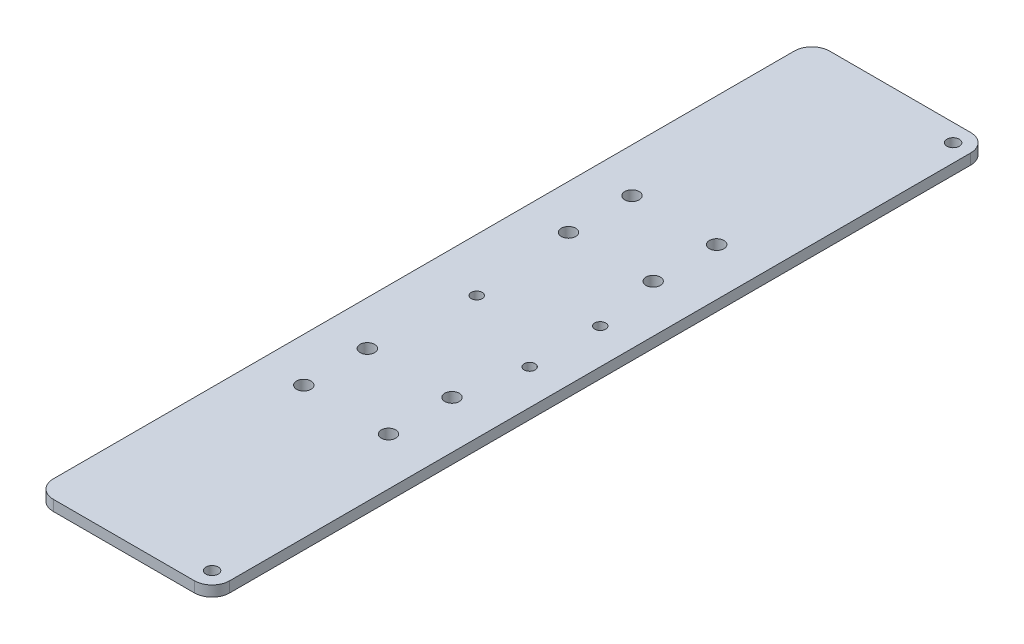
ISO-10303-21;
HEADER;
FILE_DESCRIPTION(('STEP AP214'),'2;1');
FILE_NAME('part.step','',(''),(''),'','','');
FILE_SCHEMA(('AUTOMOTIVE_DESIGN { 1 0 10303 214 1 1 1 1 }'));
ENDSEC;
DATA;
#1=APPLICATION_CONTEXT('core data for automotive mechanical design processes');
#2=APPLICATION_PROTOCOL_DEFINITION('international standard','automotive_design',2000,#1);
#3=PRODUCT_CONTEXT('',#1,'mechanical');
#4=PRODUCT('Part','Part','',(#3));
#5=PRODUCT_RELATED_PRODUCT_CATEGORY('part','',(#4));
#6=PRODUCT_DEFINITION_FORMATION('','',#4);
#7=PRODUCT_DEFINITION_CONTEXT('part definition',#1,'design');
#8=PRODUCT_DEFINITION('design','',#6,#7);
#9=PRODUCT_DEFINITION_SHAPE('','',#8);
#10=(LENGTH_UNIT() NAMED_UNIT(*) SI_UNIT(.MILLI.,.METRE.));
#11=(NAMED_UNIT(*) PLANE_ANGLE_UNIT() SI_UNIT($,.RADIAN.));
#12=(NAMED_UNIT(*) SI_UNIT($,.STERADIAN.) SOLID_ANGLE_UNIT());
#13=UNCERTAINTY_MEASURE_WITH_UNIT(LENGTH_MEASURE(1.E-05),#10,'distance_accuracy_value','');
#14=(GEOMETRIC_REPRESENTATION_CONTEXT(3) GLOBAL_UNCERTAINTY_ASSIGNED_CONTEXT((#13)) GLOBAL_UNIT_ASSIGNED_CONTEXT((#10,
#11,#12)) REPRESENTATION_CONTEXT('',''));
#15=CARTESIAN_POINT('',(0.,0.,0.));
#16=DIRECTION('',(0.,0.,1.));
#17=DIRECTION('',(1.,0.,0.));
#18=AXIS2_PLACEMENT_3D('',#15,#16,#17);
#19=CARTESIAN_POINT('',(-25.,3.,-110.));
#20=DIRECTION('',(1.,0.,0.));
#21=DIRECTION('',(0.,0.,-1.));
#22=AXIS2_PLACEMENT_3D('',#19,#20,#21);
#23=PLANE('',#22);
#24=DIRECTION('',(0.,0.,1.));
#25=VECTOR('',#24,1.);
#26=CARTESIAN_POINT('',(-25.,3.,-110.));
#27=LINE('',#26,#25);
#28=CARTESIAN_POINT('',(-25.,3.,-105.));
#29=VERTEX_POINT('',#28);
#30=CARTESIAN_POINT('',(-25.,3.,105.));
#31=VERTEX_POINT('',#30);
#32=EDGE_CURVE('E128',#29,#31,#27,.T.);
#33=ORIENTED_EDGE('',*,*,#32,.F.);
#34=DIRECTION('',(0.,-1.,0.));
#35=VECTOR('',#34,1.);
#36=CARTESIAN_POINT('',(-25.,3.,-105.));
#37=LINE('',#36,#35);
#38=CARTESIAN_POINT('',(-25.,0.,-105.));
#39=VERTEX_POINT('',#38);
#40=EDGE_CURVE('E154',#29,#39,#37,.T.);
#41=ORIENTED_EDGE('',*,*,#40,.T.);
#42=DIRECTION('',(0.,0.,1.));
#43=VECTOR('',#42,1.);
#44=CARTESIAN_POINT('',(-25.,0.,-110.));
#45=LINE('',#44,#43);
#46=CARTESIAN_POINT('',(-25.,0.,105.));
#47=VERTEX_POINT('',#46);
#48=EDGE_CURVE('E160',#39,#47,#45,.T.);
#49=ORIENTED_EDGE('',*,*,#48,.T.);
#50=DIRECTION('',(0.,-1.,0.));
#51=VECTOR('',#50,1.);
#52=CARTESIAN_POINT('',(-25.,3.,105.));
#53=LINE('',#52,#51);
#54=EDGE_CURVE('E152',#47,#31,#53,.F.);
#55=ORIENTED_EDGE('',*,*,#54,.T.);
#56=EDGE_LOOP('',(#33,#41,#49,#55));
#57=FACE_BOUND('',#56,.T.);
#58=ADVANCED_FACE('F36',(#57),#23,.F.);
#59=CARTESIAN_POINT('',(-25.,3.,110.));
#60=DIRECTION('',(0.,0.,-1.));
#61=DIRECTION('',(-1.,0.,0.));
#62=AXIS2_PLACEMENT_3D('',#59,#60,#61);
#63=PLANE('',#62);
#64=DIRECTION('',(1.,0.,0.));
#65=VECTOR('',#64,1.);
#66=CARTESIAN_POINT('',(-25.,3.,110.));
#67=LINE('',#66,#65);
#68=CARTESIAN_POINT('',(-20.,3.,110.));
#69=VERTEX_POINT('',#68);
#70=CARTESIAN_POINT('',(20.,3.,110.));
#71=VERTEX_POINT('',#70);
#72=EDGE_CURVE('E131',#69,#71,#67,.T.);
#73=ORIENTED_EDGE('',*,*,#72,.F.);
#74=DIRECTION('',(0.,-1.,0.));
#75=VECTOR('',#74,1.);
#76=CARTESIAN_POINT('',(-20.,3.,110.));
#77=LINE('',#76,#75);
#78=CARTESIAN_POINT('',(-20.,0.,110.));
#79=VERTEX_POINT('',#78);
#80=EDGE_CURVE('E11',#69,#79,#77,.T.);
#81=ORIENTED_EDGE('',*,*,#80,.T.);
#82=DIRECTION('',(1.,0.,0.));
#83=VECTOR('',#82,1.);
#84=CARTESIAN_POINT('',(-25.,0.,110.));
#85=LINE('',#84,#83);
#86=CARTESIAN_POINT('',(20.,0.,110.));
#87=VERTEX_POINT('',#86);
#88=EDGE_CURVE('E133',#79,#87,#85,.T.);
#89=ORIENTED_EDGE('',*,*,#88,.T.);
#90=DIRECTION('',(0.,-1.,0.));
#91=VECTOR('',#90,1.);
#92=CARTESIAN_POINT('',(20.,3.,110.));
#93=LINE('',#92,#91);
#94=EDGE_CURVE('E44',#87,#71,#93,.F.);
#95=ORIENTED_EDGE('',*,*,#94,.T.);
#96=EDGE_LOOP('',(#73,#81,#89,#95));
#97=FACE_BOUND('',#96,.T.);
#98=ADVANCED_FACE('F293',(#97),#63,.F.);
#99=CARTESIAN_POINT('',(25.,3.,-110.));
#100=DIRECTION('',(-1.,0.,0.));
#101=DIRECTION('',(0.,0.,1.));
#102=AXIS2_PLACEMENT_3D('',#99,#100,#101);
#103=PLANE('',#102);
#104=DIRECTION('',(0.,0.,-1.));
#105=VECTOR('',#104,1.);
#106=CARTESIAN_POINT('',(25.,0.,-110.));
#107=LINE('',#106,#105);
#108=CARTESIAN_POINT('',(25.,0.,105.));
#109=VERTEX_POINT('',#108);
#110=CARTESIAN_POINT('',(25.,0.,-105.));
#111=VERTEX_POINT('',#110);
#112=EDGE_CURVE('E129',#109,#111,#107,.T.);
#113=ORIENTED_EDGE('',*,*,#112,.T.);
#114=DIRECTION('',(0.,-1.,0.));
#115=VECTOR('',#114,1.);
#116=CARTESIAN_POINT('',(25.,3.,-105.));
#117=LINE('',#116,#115);
#118=CARTESIAN_POINT('',(25.,3.,-105.));
#119=VERTEX_POINT('',#118);
#120=EDGE_CURVE('E107',#111,#119,#117,.F.);
#121=ORIENTED_EDGE('',*,*,#120,.T.);
#122=DIRECTION('',(0.,0.,-1.));
#123=VECTOR('',#122,1.);
#124=CARTESIAN_POINT('',(25.,3.,-110.));
#125=LINE('',#124,#123);
#126=CARTESIAN_POINT('',(25.,3.,105.));
#127=VERTEX_POINT('',#126);
#128=EDGE_CURVE('E172',#127,#119,#125,.T.);
#129=ORIENTED_EDGE('',*,*,#128,.F.);
#130=DIRECTION('',(0.,-1.,0.));
#131=VECTOR('',#130,1.);
#132=CARTESIAN_POINT('',(25.,3.,105.));
#133=LINE('',#132,#131);
#134=EDGE_CURVE('E112',#127,#109,#133,.T.);
#135=ORIENTED_EDGE('',*,*,#134,.T.);
#136=EDGE_LOOP('',(#113,#121,#129,#135));
#137=FACE_BOUND('',#136,.T.);
#138=ADVANCED_FACE('F291',(#137),#103,.F.);
#139=CARTESIAN_POINT('',(-25.,3.,-110.));
#140=DIRECTION('',(0.,0.,1.));
#141=DIRECTION('',(1.,0.,0.));
#142=AXIS2_PLACEMENT_3D('',#139,#140,#141);
#143=PLANE('',#142);
#144=DIRECTION('',(-1.,0.,0.));
#145=VECTOR('',#144,1.);
#146=CARTESIAN_POINT('',(-25.,3.,-110.));
#147=LINE('',#146,#145);
#148=CARTESIAN_POINT('',(20.,3.,-110.));
#149=VERTEX_POINT('',#148);
#150=CARTESIAN_POINT('',(-20.,3.,-110.));
#151=VERTEX_POINT('',#150);
#152=EDGE_CURVE('E122',#149,#151,#147,.T.);
#153=ORIENTED_EDGE('',*,*,#152,.F.);
#154=DIRECTION('',(0.,-1.,0.));
#155=VECTOR('',#154,1.);
#156=CARTESIAN_POINT('',(20.,3.,-110.));
#157=LINE('',#156,#155);
#158=CARTESIAN_POINT('',(20.,0.,-110.));
#159=VERTEX_POINT('',#158);
#160=EDGE_CURVE('E106',#149,#159,#157,.T.);
#161=ORIENTED_EDGE('',*,*,#160,.T.);
#162=DIRECTION('',(-1.,0.,0.));
#163=VECTOR('',#162,1.);
#164=CARTESIAN_POINT('',(-25.,0.,-110.));
#165=LINE('',#164,#163);
#166=CARTESIAN_POINT('',(-20.,0.,-110.));
#167=VERTEX_POINT('',#166);
#168=EDGE_CURVE('E119',#159,#167,#165,.T.);
#169=ORIENTED_EDGE('',*,*,#168,.T.);
#170=DIRECTION('',(0.,-1.,0.));
#171=VECTOR('',#170,1.);
#172=CARTESIAN_POINT('',(-20.,3.,-110.));
#173=LINE('',#172,#171);
#174=EDGE_CURVE('E124',#167,#151,#173,.F.);
#175=ORIENTED_EDGE('',*,*,#174,.T.);
#176=EDGE_LOOP('',(#153,#161,#169,#175));
#177=FACE_BOUND('',#176,.T.);
#178=ADVANCED_FACE('F118',(#177),#143,.F.);
#179=CARTESIAN_POINT('',(-25.,3.,110.));
#180=DIRECTION('',(0.,1.,0.));
#181=DIRECTION('',(0.,0.,1.));
#182=AXIS2_PLACEMENT_3D('',#179,#180,#181);
#183=PLANE('',#182);
#184=CARTESIAN_POINT('',(11.5,3.,46.5));
#185=DIRECTION('',(0.,1.,0.));
#186=DIRECTION('',(0.,0.,1.));
#187=AXIS2_PLACEMENT_3D('',#184,#185,#186);
#188=CIRCLE('',#187,2.05);
#189=CARTESIAN_POINT('',(11.5,3.,48.55));
#190=VERTEX_POINT('',#189);
#191=EDGE_CURVE('E245',#190,#190,#188,.T.);
#192=ORIENTED_EDGE('',*,*,#191,.F.);
#193=EDGE_LOOP('',(#192));
#194=FACE_BOUND('',#193,.T.);
#195=CARTESIAN_POINT('',(-12.5,3.,46.5));
#196=DIRECTION('',(0.,1.,0.));
#197=DIRECTION('',(0.,0.,1.));
#198=AXIS2_PLACEMENT_3D('',#195,#196,#197);
#199=CIRCLE('',#198,2.05);
#200=CARTESIAN_POINT('',(-12.5,3.,48.55));
#201=VERTEX_POINT('',#200);
#202=EDGE_CURVE('E239',#201,#201,#199,.T.);
#203=ORIENTED_EDGE('',*,*,#202,.F.);
#204=EDGE_LOOP('',(#203));
#205=FACE_BOUND('',#204,.T.);
#206=CARTESIAN_POINT('',(11.5,3.,28.5));
#207=DIRECTION('',(0.,1.,0.));
#208=DIRECTION('',(0.,0.,1.));
#209=AXIS2_PLACEMENT_3D('',#206,#207,#208);
#210=CIRCLE('',#209,2.05);
#211=CARTESIAN_POINT('',(11.5,3.,30.55));
#212=VERTEX_POINT('',#211);
#213=EDGE_CURVE('E233',#212,#212,#210,.T.);
#214=ORIENTED_EDGE('',*,*,#213,.F.);
#215=EDGE_LOOP('',(#214));
#216=FACE_BOUND('',#215,.T.);
#217=CARTESIAN_POINT('',(-12.5,3.,28.5));
#218=DIRECTION('',(0.,1.,0.));
#219=DIRECTION('',(0.,0.,1.));
#220=AXIS2_PLACEMENT_3D('',#217,#218,#219);
#221=CIRCLE('',#220,2.05);
#222=CARTESIAN_POINT('',(-12.5,3.,30.55));
#223=VERTEX_POINT('',#222);
#224=EDGE_CURVE('E227',#223,#223,#221,.T.);
#225=ORIENTED_EDGE('',*,*,#224,.F.);
#226=EDGE_LOOP('',(#225));
#227=FACE_BOUND('',#226,.T.);
#228=CARTESIAN_POINT('',(20.,3.,105.));
#229=DIRECTION('',(0.,1.,0.));
#230=DIRECTION('',(0.,0.,1.));
#231=AXIS2_PLACEMENT_3D('',#228,#229,#230);
#232=CIRCLE('',#231,1.75);
#233=CARTESIAN_POINT('',(20.,3.,106.75));
#234=VERTEX_POINT('',#233);
#235=EDGE_CURVE('E221',#234,#234,#232,.T.);
#236=ORIENTED_EDGE('',*,*,#235,.F.);
#237=EDGE_LOOP('',(#236));
#238=FACE_BOUND('',#237,.T.);
#239=CARTESIAN_POINT('',(-10.,3.,0.));
#240=DIRECTION('',(0.,1.,0.));
#241=DIRECTION('',(0.,0.,1.));
#242=AXIS2_PLACEMENT_3D('',#239,#240,#241);
#243=CIRCLE('',#242,1.55);
#244=CARTESIAN_POINT('',(-10.,3.,1.55));
#245=VERTEX_POINT('',#244);
#246=EDGE_CURVE('E215',#245,#245,#243,.T.);
#247=ORIENTED_EDGE('',*,*,#246,.F.);
#248=EDGE_LOOP('',(#247));
#249=FACE_BOUND('',#248,.T.);
#250=CARTESIAN_POINT('',(15.,3.,10.));
#251=DIRECTION('',(0.,1.,0.));
#252=DIRECTION('',(0.,0.,1.));
#253=AXIS2_PLACEMENT_3D('',#250,#251,#252);
#254=CIRCLE('',#253,1.55);
#255=CARTESIAN_POINT('',(15.,3.,11.55));
#256=VERTEX_POINT('',#255);
#257=EDGE_CURVE('E209',#256,#256,#254,.T.);
#258=ORIENTED_EDGE('',*,*,#257,.F.);
#259=EDGE_LOOP('',(#258));
#260=FACE_BOUND('',#259,.T.);
#261=CARTESIAN_POINT('',(15.,3.,-10.));
#262=DIRECTION('',(0.,1.,0.));
#263=DIRECTION('',(0.,0.,1.));
#264=AXIS2_PLACEMENT_3D('',#261,#262,#263);
#265=CIRCLE('',#264,1.55);
#266=CARTESIAN_POINT('',(15.,3.,-8.45));
#267=VERTEX_POINT('',#266);
#268=EDGE_CURVE('E203',#267,#267,#265,.T.);
#269=ORIENTED_EDGE('',*,*,#268,.F.);
#270=EDGE_LOOP('',(#269));
#271=FACE_BOUND('',#270,.T.);
#272=CARTESIAN_POINT('',(11.5,3.,-28.5));
#273=DIRECTION('',(0.,1.,0.));
#274=DIRECTION('',(0.,0.,1.));
#275=AXIS2_PLACEMENT_3D('',#272,#273,#274);
#276=CIRCLE('',#275,2.05);
#277=CARTESIAN_POINT('',(11.5,3.,-26.45));
#278=VERTEX_POINT('',#277);
#279=EDGE_CURVE('E194',#278,#278,#276,.T.);
#280=ORIENTED_EDGE('',*,*,#279,.F.);
#281=EDGE_LOOP('',(#280));
#282=FACE_BOUND('',#281,.T.);
#283=CARTESIAN_POINT('',(-12.5,3.,-28.5));
#284=DIRECTION('',(0.,1.,0.));
#285=DIRECTION('',(0.,0.,1.));
#286=AXIS2_PLACEMENT_3D('',#283,#284,#285);
#287=CIRCLE('',#286,2.05);
#288=CARTESIAN_POINT('',(-12.5,3.,-26.45));
#289=VERTEX_POINT('',#288);
#290=EDGE_CURVE('E188',#289,#289,#287,.T.);
#291=ORIENTED_EDGE('',*,*,#290,.F.);
#292=EDGE_LOOP('',(#291));
#293=FACE_BOUND('',#292,.T.);
#294=CARTESIAN_POINT('',(11.5,3.,-46.5));
#295=DIRECTION('',(0.,1.,0.));
#296=DIRECTION('',(0.,0.,1.));
#297=AXIS2_PLACEMENT_3D('',#294,#295,#296);
#298=CIRCLE('',#297,2.05);
#299=CARTESIAN_POINT('',(11.5,3.,-44.45));
#300=VERTEX_POINT('',#299);
#301=EDGE_CURVE('E182',#300,#300,#298,.T.);
#302=ORIENTED_EDGE('',*,*,#301,.F.);
#303=EDGE_LOOP('',(#302));
#304=FACE_BOUND('',#303,.T.);
#305=CARTESIAN_POINT('',(-12.5,3.,-46.5));
#306=DIRECTION('',(0.,1.,0.));
#307=DIRECTION('',(0.,0.,1.));
#308=AXIS2_PLACEMENT_3D('',#305,#306,#307);
#309=CIRCLE('',#308,2.05);
#310=CARTESIAN_POINT('',(-12.5,3.,-44.45));
#311=VERTEX_POINT('',#310);
#312=EDGE_CURVE('E179',#311,#311,#309,.T.);
#313=ORIENTED_EDGE('',*,*,#312,.F.);
#314=EDGE_LOOP('',(#313));
#315=FACE_BOUND('',#314,.T.);
#316=CARTESIAN_POINT('',(20.,3.,-105.));
#317=DIRECTION('',(0.,1.,0.));
#318=DIRECTION('',(0.,0.,1.));
#319=AXIS2_PLACEMENT_3D('',#316,#317,#318);
#320=CIRCLE('',#319,1.75);
#321=CARTESIAN_POINT('',(20.,3.,-103.25));
#322=VERTEX_POINT('',#321);
#323=EDGE_CURVE('E168',#322,#322,#320,.T.);
#324=ORIENTED_EDGE('',*,*,#323,.F.);
#325=EDGE_LOOP('',(#324));
#326=FACE_BOUND('',#325,.T.);
#327=ORIENTED_EDGE('',*,*,#128,.T.);
#328=CARTESIAN_POINT('',(20.,3.,-105.));
#329=DIRECTION('',(0.,1.,0.));
#330=DIRECTION('',(0.,0.,1.));
#331=AXIS2_PLACEMENT_3D('',#328,#329,#330);
#332=CIRCLE('',#331,5.);
#333=EDGE_CURVE('E150',#119,#149,#332,.T.);
#334=ORIENTED_EDGE('',*,*,#333,.T.);
#335=ORIENTED_EDGE('',*,*,#152,.T.);
#336=CARTESIAN_POINT('',(-20.,3.,-105.));
#337=DIRECTION('',(0.,1.,0.));
#338=DIRECTION('',(0.,0.,1.));
#339=AXIS2_PLACEMENT_3D('',#336,#337,#338);
#340=CIRCLE('',#339,5.);
#341=EDGE_CURVE('E148',#151,#29,#340,.T.);
#342=ORIENTED_EDGE('',*,*,#341,.T.);
#343=ORIENTED_EDGE('',*,*,#32,.T.);
#344=CARTESIAN_POINT('',(-20.,3.,105.));
#345=DIRECTION('',(0.,1.,0.));
#346=DIRECTION('',(0.,0.,1.));
#347=AXIS2_PLACEMENT_3D('',#344,#345,#346);
#348=CIRCLE('',#347,5.);
#349=EDGE_CURVE('E57',#31,#69,#348,.T.);
#350=ORIENTED_EDGE('',*,*,#349,.T.);
#351=ORIENTED_EDGE('',*,*,#72,.T.);
#352=CARTESIAN_POINT('',(20.,3.,105.));
#353=DIRECTION('',(0.,1.,0.));
#354=DIRECTION('',(0.,0.,1.));
#355=AXIS2_PLACEMENT_3D('',#352,#353,#354);
#356=CIRCLE('',#355,5.);
#357=EDGE_CURVE('E145',#71,#127,#356,.T.);
#358=ORIENTED_EDGE('',*,*,#357,.T.);
#359=EDGE_LOOP('',(#327,#334,#335,#342,#343,#350,#351,#358));
#360=FACE_BOUND('',#359,.T.);
#361=ADVANCED_FACE('F260',(#194,#205,#216,#227,#238,#249,#260,#271,#282,#293,#304,#315,#326,
#360),#183,.T.);
#362=CARTESIAN_POINT('',(-25.,0.,110.));
#363=DIRECTION('',(0.,1.,0.));
#364=DIRECTION('',(0.,0.,1.));
#365=AXIS2_PLACEMENT_3D('',#362,#363,#364);
#366=PLANE('',#365);
#367=CARTESIAN_POINT('',(11.5,0.,46.5));
#368=DIRECTION('',(0.,1.,0.));
#369=DIRECTION('',(0.,0.,1.));
#370=AXIS2_PLACEMENT_3D('',#367,#368,#369);
#371=CIRCLE('',#370,2.05);
#372=CARTESIAN_POINT('',(11.5,0.,48.55));
#373=VERTEX_POINT('',#372);
#374=EDGE_CURVE('E242',#373,#373,#371,.T.);
#375=ORIENTED_EDGE('',*,*,#374,.T.);
#376=EDGE_LOOP('',(#375));
#377=FACE_BOUND('',#376,.T.);
#378=CARTESIAN_POINT('',(-12.5,0.,46.5));
#379=DIRECTION('',(0.,1.,0.));
#380=DIRECTION('',(0.,0.,1.));
#381=AXIS2_PLACEMENT_3D('',#378,#379,#380);
#382=CIRCLE('',#381,2.05);
#383=CARTESIAN_POINT('',(-12.5,0.,48.55));
#384=VERTEX_POINT('',#383);
#385=EDGE_CURVE('E236',#384,#384,#382,.T.);
#386=ORIENTED_EDGE('',*,*,#385,.T.);
#387=EDGE_LOOP('',(#386));
#388=FACE_BOUND('',#387,.T.);
#389=CARTESIAN_POINT('',(11.5,0.,28.5));
#390=DIRECTION('',(0.,1.,0.));
#391=DIRECTION('',(0.,0.,1.));
#392=AXIS2_PLACEMENT_3D('',#389,#390,#391);
#393=CIRCLE('',#392,2.05);
#394=CARTESIAN_POINT('',(11.5,0.,30.55));
#395=VERTEX_POINT('',#394);
#396=EDGE_CURVE('E230',#395,#395,#393,.T.);
#397=ORIENTED_EDGE('',*,*,#396,.T.);
#398=EDGE_LOOP('',(#397));
#399=FACE_BOUND('',#398,.T.);
#400=CARTESIAN_POINT('',(-12.5,0.,28.5));
#401=DIRECTION('',(0.,1.,0.));
#402=DIRECTION('',(0.,0.,1.));
#403=AXIS2_PLACEMENT_3D('',#400,#401,#402);
#404=CIRCLE('',#403,2.05);
#405=CARTESIAN_POINT('',(-12.5,0.,30.55));
#406=VERTEX_POINT('',#405);
#407=EDGE_CURVE('E224',#406,#406,#404,.T.);
#408=ORIENTED_EDGE('',*,*,#407,.T.);
#409=EDGE_LOOP('',(#408));
#410=FACE_BOUND('',#409,.T.);
#411=CARTESIAN_POINT('',(20.,0.,105.));
#412=DIRECTION('',(0.,1.,0.));
#413=DIRECTION('',(0.,0.,1.));
#414=AXIS2_PLACEMENT_3D('',#411,#412,#413);
#415=CIRCLE('',#414,1.75);
#416=CARTESIAN_POINT('',(20.,0.,106.75));
#417=VERTEX_POINT('',#416);
#418=EDGE_CURVE('E218',#417,#417,#415,.T.);
#419=ORIENTED_EDGE('',*,*,#418,.T.);
#420=EDGE_LOOP('',(#419));
#421=FACE_BOUND('',#420,.T.);
#422=CARTESIAN_POINT('',(-10.,0.,0.));
#423=DIRECTION('',(0.,1.,0.));
#424=DIRECTION('',(0.,0.,1.));
#425=AXIS2_PLACEMENT_3D('',#422,#423,#424);
#426=CIRCLE('',#425,1.55);
#427=CARTESIAN_POINT('',(-10.,0.,1.55));
#428=VERTEX_POINT('',#427);
#429=EDGE_CURVE('E212',#428,#428,#426,.T.);
#430=ORIENTED_EDGE('',*,*,#429,.T.);
#431=EDGE_LOOP('',(#430));
#432=FACE_BOUND('',#431,.T.);
#433=CARTESIAN_POINT('',(15.,0.,10.));
#434=DIRECTION('',(0.,1.,0.));
#435=DIRECTION('',(0.,0.,1.));
#436=AXIS2_PLACEMENT_3D('',#433,#434,#435);
#437=CIRCLE('',#436,1.55);
#438=CARTESIAN_POINT('',(15.,0.,11.55));
#439=VERTEX_POINT('',#438);
#440=EDGE_CURVE('E206',#439,#439,#437,.T.);
#441=ORIENTED_EDGE('',*,*,#440,.T.);
#442=EDGE_LOOP('',(#441));
#443=FACE_BOUND('',#442,.T.);
#444=CARTESIAN_POINT('',(15.,0.,-10.));
#445=DIRECTION('',(0.,1.,0.));
#446=DIRECTION('',(0.,0.,1.));
#447=AXIS2_PLACEMENT_3D('',#444,#445,#446);
#448=CIRCLE('',#447,1.55);
#449=CARTESIAN_POINT('',(15.,0.,-8.45));
#450=VERTEX_POINT('',#449);
#451=EDGE_CURVE('E200',#450,#450,#448,.T.);
#452=ORIENTED_EDGE('',*,*,#451,.T.);
#453=EDGE_LOOP('',(#452));
#454=FACE_BOUND('',#453,.T.);
#455=CARTESIAN_POINT('',(11.5,0.,-28.5));
#456=DIRECTION('',(0.,1.,0.));
#457=DIRECTION('',(0.,0.,1.));
#458=AXIS2_PLACEMENT_3D('',#455,#456,#457);
#459=CIRCLE('',#458,2.05);
#460=CARTESIAN_POINT('',(11.5,0.,-26.45));
#461=VERTEX_POINT('',#460);
#462=EDGE_CURVE('E197',#461,#461,#459,.T.);
#463=ORIENTED_EDGE('',*,*,#462,.T.);
#464=EDGE_LOOP('',(#463));
#465=FACE_BOUND('',#464,.T.);
#466=CARTESIAN_POINT('',(-12.5,0.,-28.5));
#467=DIRECTION('',(0.,1.,0.));
#468=DIRECTION('',(0.,0.,1.));
#469=AXIS2_PLACEMENT_3D('',#466,#467,#468);
#470=CIRCLE('',#469,2.05);
#471=CARTESIAN_POINT('',(-12.5,0.,-26.45));
#472=VERTEX_POINT('',#471);
#473=EDGE_CURVE('E191',#472,#472,#470,.T.);
#474=ORIENTED_EDGE('',*,*,#473,.T.);
#475=EDGE_LOOP('',(#474));
#476=FACE_BOUND('',#475,.T.);
#477=CARTESIAN_POINT('',(11.5,0.,-46.5));
#478=DIRECTION('',(0.,1.,0.));
#479=DIRECTION('',(0.,0.,1.));
#480=AXIS2_PLACEMENT_3D('',#477,#478,#479);
#481=CIRCLE('',#480,2.05);
#482=CARTESIAN_POINT('',(11.5,0.,-44.45));
#483=VERTEX_POINT('',#482);
#484=EDGE_CURVE('E185',#483,#483,#481,.T.);
#485=ORIENTED_EDGE('',*,*,#484,.T.);
#486=EDGE_LOOP('',(#485));
#487=FACE_BOUND('',#486,.T.);
#488=CARTESIAN_POINT('',(-12.5,0.,-46.5));
#489=DIRECTION('',(0.,1.,0.));
#490=DIRECTION('',(0.,0.,1.));
#491=AXIS2_PLACEMENT_3D('',#488,#489,#490);
#492=CIRCLE('',#491,2.05);
#493=CARTESIAN_POINT('',(-12.5,0.,-44.45));
#494=VERTEX_POINT('',#493);
#495=EDGE_CURVE('E177',#494,#494,#492,.T.);
#496=ORIENTED_EDGE('',*,*,#495,.T.);
#497=EDGE_LOOP('',(#496));
#498=FACE_BOUND('',#497,.T.);
#499=CARTESIAN_POINT('',(20.,0.,-105.));
#500=DIRECTION('',(0.,1.,0.));
#501=DIRECTION('',(0.,0.,1.));
#502=AXIS2_PLACEMENT_3D('',#499,#500,#501);
#503=CIRCLE('',#502,1.75);
#504=CARTESIAN_POINT('',(20.,0.,-103.25));
#505=VERTEX_POINT('',#504);
#506=EDGE_CURVE('E165',#505,#505,#503,.T.);
#507=ORIENTED_EDGE('',*,*,#506,.T.);
#508=EDGE_LOOP('',(#507));
#509=FACE_BOUND('',#508,.T.);
#510=ORIENTED_EDGE('',*,*,#168,.F.);
#511=CARTESIAN_POINT('',(20.,0.,-105.));
#512=DIRECTION('',(0.,1.,0.));
#513=DIRECTION('',(0.,0.,1.));
#514=AXIS2_PLACEMENT_3D('',#511,#512,#513);
#515=CIRCLE('',#514,5.);
#516=EDGE_CURVE('E102',#159,#111,#515,.F.);
#517=ORIENTED_EDGE('',*,*,#516,.T.);
#518=ORIENTED_EDGE('',*,*,#112,.F.);
#519=CARTESIAN_POINT('',(20.,0.,105.));
#520=DIRECTION('',(0.,1.,0.));
#521=DIRECTION('',(0.,0.,1.));
#522=AXIS2_PLACEMENT_3D('',#519,#520,#521);
#523=CIRCLE('',#522,5.);
#524=EDGE_CURVE('E123',#109,#87,#523,.F.);
#525=ORIENTED_EDGE('',*,*,#524,.T.);
#526=ORIENTED_EDGE('',*,*,#88,.F.);
#527=CARTESIAN_POINT('',(-20.,0.,105.));
#528=DIRECTION('',(0.,1.,0.));
#529=DIRECTION('',(0.,0.,1.));
#530=AXIS2_PLACEMENT_3D('',#527,#528,#529);
#531=CIRCLE('',#530,5.);
#532=EDGE_CURVE('E139',#79,#47,#531,.F.);
#533=ORIENTED_EDGE('',*,*,#532,.T.);
#534=ORIENTED_EDGE('',*,*,#48,.F.);
#535=CARTESIAN_POINT('',(-20.,0.,-105.));
#536=DIRECTION('',(0.,1.,0.));
#537=DIRECTION('',(0.,0.,1.));
#538=AXIS2_PLACEMENT_3D('',#535,#536,#537);
#539=CIRCLE('',#538,5.);
#540=EDGE_CURVE('E113',#39,#167,#539,.F.);
#541=ORIENTED_EDGE('',*,*,#540,.T.);
#542=EDGE_LOOP('',(#510,#517,#518,#525,#526,#533,#534,#541));
#543=FACE_BOUND('',#542,.T.);
#544=ADVANCED_FACE('F126',(#377,#388,#399,#410,#421,#432,#443,#454,#465,#476,#487,#498,#509,
#543),#366,.F.);
#545=CARTESIAN_POINT('',(20.,0.,-105.));
#546=DIRECTION('',(0.,1.,0.));
#547=DIRECTION('',(0.,0.,1.));
#548=AXIS2_PLACEMENT_3D('',#545,#546,#547);
#549=CYLINDRICAL_SURFACE('',#548,1.75);
#550=ORIENTED_EDGE('',*,*,#506,.F.);
#551=EDGE_LOOP('',(#550));
#552=FACE_BOUND('',#551,.T.);
#553=ORIENTED_EDGE('',*,*,#323,.T.);
#554=EDGE_LOOP('',(#553));
#555=FACE_BOUND('',#554,.T.);
#556=ADVANCED_FACE('F317',(#552,#555),#549,.F.);
#557=CARTESIAN_POINT('',(-12.5,0.,-46.5));
#558=DIRECTION('',(0.,1.,0.));
#559=DIRECTION('',(0.,0.,1.));
#560=AXIS2_PLACEMENT_3D('',#557,#558,#559);
#561=CYLINDRICAL_SURFACE('',#560,2.05);
#562=ORIENTED_EDGE('',*,*,#495,.F.);
#563=EDGE_LOOP('',(#562));
#564=FACE_BOUND('',#563,.T.);
#565=ORIENTED_EDGE('',*,*,#312,.T.);
#566=EDGE_LOOP('',(#565));
#567=FACE_BOUND('',#566,.T.);
#568=ADVANCED_FACE('F321',(#564,#567),#561,.F.);
#569=CARTESIAN_POINT('',(11.5,0.,-46.5));
#570=DIRECTION('',(0.,1.,0.));
#571=DIRECTION('',(0.,0.,1.));
#572=AXIS2_PLACEMENT_3D('',#569,#570,#571);
#573=CYLINDRICAL_SURFACE('',#572,2.05);
#574=ORIENTED_EDGE('',*,*,#484,.F.);
#575=EDGE_LOOP('',(#574));
#576=FACE_BOUND('',#575,.T.);
#577=ORIENTED_EDGE('',*,*,#301,.T.);
#578=EDGE_LOOP('',(#577));
#579=FACE_BOUND('',#578,.T.);
#580=ADVANCED_FACE('F325',(#576,#579),#573,.F.);
#581=CARTESIAN_POINT('',(-12.5,0.,-28.5));
#582=DIRECTION('',(0.,1.,0.));
#583=DIRECTION('',(0.,0.,1.));
#584=AXIS2_PLACEMENT_3D('',#581,#582,#583);
#585=CYLINDRICAL_SURFACE('',#584,2.05);
#586=ORIENTED_EDGE('',*,*,#473,.F.);
#587=EDGE_LOOP('',(#586));
#588=FACE_BOUND('',#587,.T.);
#589=ORIENTED_EDGE('',*,*,#290,.T.);
#590=EDGE_LOOP('',(#589));
#591=FACE_BOUND('',#590,.T.);
#592=ADVANCED_FACE('F329',(#588,#591),#585,.F.);
#593=CARTESIAN_POINT('',(11.5,0.,-28.5));
#594=DIRECTION('',(0.,1.,0.));
#595=DIRECTION('',(0.,0.,1.));
#596=AXIS2_PLACEMENT_3D('',#593,#594,#595);
#597=CYLINDRICAL_SURFACE('',#596,2.05);
#598=ORIENTED_EDGE('',*,*,#462,.F.);
#599=EDGE_LOOP('',(#598));
#600=FACE_BOUND('',#599,.T.);
#601=ORIENTED_EDGE('',*,*,#279,.T.);
#602=EDGE_LOOP('',(#601));
#603=FACE_BOUND('',#602,.T.);
#604=ADVANCED_FACE('F333',(#600,#603),#597,.F.);
#605=CARTESIAN_POINT('',(15.,0.,-10.));
#606=DIRECTION('',(0.,1.,0.));
#607=DIRECTION('',(0.,0.,1.));
#608=AXIS2_PLACEMENT_3D('',#605,#606,#607);
#609=CYLINDRICAL_SURFACE('',#608,1.55);
#610=ORIENTED_EDGE('',*,*,#451,.F.);
#611=EDGE_LOOP('',(#610));
#612=FACE_BOUND('',#611,.T.);
#613=ORIENTED_EDGE('',*,*,#268,.T.);
#614=EDGE_LOOP('',(#613));
#615=FACE_BOUND('',#614,.T.);
#616=ADVANCED_FACE('F337',(#612,#615),#609,.F.);
#617=CARTESIAN_POINT('',(15.,0.,10.));
#618=DIRECTION('',(0.,1.,0.));
#619=DIRECTION('',(0.,0.,1.));
#620=AXIS2_PLACEMENT_3D('',#617,#618,#619);
#621=CYLINDRICAL_SURFACE('',#620,1.55);
#622=ORIENTED_EDGE('',*,*,#440,.F.);
#623=EDGE_LOOP('',(#622));
#624=FACE_BOUND('',#623,.T.);
#625=ORIENTED_EDGE('',*,*,#257,.T.);
#626=EDGE_LOOP('',(#625));
#627=FACE_BOUND('',#626,.T.);
#628=ADVANCED_FACE('F341',(#624,#627),#621,.F.);
#629=CARTESIAN_POINT('',(-10.,0.,0.));
#630=DIRECTION('',(0.,1.,0.));
#631=DIRECTION('',(0.,0.,1.));
#632=AXIS2_PLACEMENT_3D('',#629,#630,#631);
#633=CYLINDRICAL_SURFACE('',#632,1.55);
#634=ORIENTED_EDGE('',*,*,#429,.F.);
#635=EDGE_LOOP('',(#634));
#636=FACE_BOUND('',#635,.T.);
#637=ORIENTED_EDGE('',*,*,#246,.T.);
#638=EDGE_LOOP('',(#637));
#639=FACE_BOUND('',#638,.T.);
#640=ADVANCED_FACE('F345',(#636,#639),#633,.F.);
#641=CARTESIAN_POINT('',(20.,0.,105.));
#642=DIRECTION('',(0.,1.,0.));
#643=DIRECTION('',(0.,0.,1.));
#644=AXIS2_PLACEMENT_3D('',#641,#642,#643);
#645=CYLINDRICAL_SURFACE('',#644,1.75);
#646=ORIENTED_EDGE('',*,*,#418,.F.);
#647=EDGE_LOOP('',(#646));
#648=FACE_BOUND('',#647,.T.);
#649=ORIENTED_EDGE('',*,*,#235,.T.);
#650=EDGE_LOOP('',(#649));
#651=FACE_BOUND('',#650,.T.);
#652=ADVANCED_FACE('F349',(#648,#651),#645,.F.);
#653=CARTESIAN_POINT('',(-12.5,0.,28.5));
#654=DIRECTION('',(0.,1.,0.));
#655=DIRECTION('',(0.,0.,1.));
#656=AXIS2_PLACEMENT_3D('',#653,#654,#655);
#657=CYLINDRICAL_SURFACE('',#656,2.05);
#658=ORIENTED_EDGE('',*,*,#407,.F.);
#659=EDGE_LOOP('',(#658));
#660=FACE_BOUND('',#659,.T.);
#661=ORIENTED_EDGE('',*,*,#224,.T.);
#662=EDGE_LOOP('',(#661));
#663=FACE_BOUND('',#662,.T.);
#664=ADVANCED_FACE('F353',(#660,#663),#657,.F.);
#665=CARTESIAN_POINT('',(11.5,0.,28.5));
#666=DIRECTION('',(0.,1.,0.));
#667=DIRECTION('',(0.,0.,1.));
#668=AXIS2_PLACEMENT_3D('',#665,#666,#667);
#669=CYLINDRICAL_SURFACE('',#668,2.05);
#670=ORIENTED_EDGE('',*,*,#396,.F.);
#671=EDGE_LOOP('',(#670));
#672=FACE_BOUND('',#671,.T.);
#673=ORIENTED_EDGE('',*,*,#213,.T.);
#674=EDGE_LOOP('',(#673));
#675=FACE_BOUND('',#674,.T.);
#676=ADVANCED_FACE('F357',(#672,#675),#669,.F.);
#677=CARTESIAN_POINT('',(-12.5,0.,46.5));
#678=DIRECTION('',(0.,1.,0.));
#679=DIRECTION('',(0.,0.,1.));
#680=AXIS2_PLACEMENT_3D('',#677,#678,#679);
#681=CYLINDRICAL_SURFACE('',#680,2.05);
#682=ORIENTED_EDGE('',*,*,#385,.F.);
#683=EDGE_LOOP('',(#682));
#684=FACE_BOUND('',#683,.T.);
#685=ORIENTED_EDGE('',*,*,#202,.T.);
#686=EDGE_LOOP('',(#685));
#687=FACE_BOUND('',#686,.T.);
#688=ADVANCED_FACE('F256',(#684,#687),#681,.F.);
#689=CARTESIAN_POINT('',(11.5,0.,46.5));
#690=DIRECTION('',(0.,1.,0.));
#691=DIRECTION('',(0.,0.,1.));
#692=AXIS2_PLACEMENT_3D('',#689,#690,#691);
#693=CYLINDRICAL_SURFACE('',#692,2.05);
#694=ORIENTED_EDGE('',*,*,#374,.F.);
#695=EDGE_LOOP('',(#694));
#696=FACE_BOUND('',#695,.T.);
#697=ORIENTED_EDGE('',*,*,#191,.T.);
#698=EDGE_LOOP('',(#697));
#699=FACE_BOUND('',#698,.T.);
#700=ADVANCED_FACE('F253',(#696,#699),#693,.F.);
#701=CARTESIAN_POINT('',(20.,3.,-105.));
#702=DIRECTION('',(0.,-1.,0.));
#703=DIRECTION('',(0.,0.,-1.));
#704=AXIS2_PLACEMENT_3D('',#701,#702,#703);
#705=CYLINDRICAL_SURFACE('',#704,5.);
#706=ORIENTED_EDGE('',*,*,#333,.F.);
#707=ORIENTED_EDGE('',*,*,#120,.F.);
#708=ORIENTED_EDGE('',*,*,#516,.F.);
#709=ORIENTED_EDGE('',*,*,#160,.F.);
#710=EDGE_LOOP('',(#706,#707,#708,#709));
#711=FACE_BOUND('',#710,.T.);
#712=ADVANCED_FACE('F105',(#711),#705,.T.);
#713=CARTESIAN_POINT('',(-20.,3.,-105.));
#714=DIRECTION('',(0.,-1.,0.));
#715=DIRECTION('',(0.,0.,-1.));
#716=AXIS2_PLACEMENT_3D('',#713,#714,#715);
#717=CYLINDRICAL_SURFACE('',#716,5.);
#718=ORIENTED_EDGE('',*,*,#341,.F.);
#719=ORIENTED_EDGE('',*,*,#174,.F.);
#720=ORIENTED_EDGE('',*,*,#540,.F.);
#721=ORIENTED_EDGE('',*,*,#40,.F.);
#722=EDGE_LOOP('',(#718,#719,#720,#721));
#723=FACE_BOUND('',#722,.T.);
#724=ADVANCED_FACE('F297',(#723),#717,.T.);
#725=CARTESIAN_POINT('',(-20.,3.,105.));
#726=DIRECTION('',(0.,-1.,0.));
#727=DIRECTION('',(0.,0.,-1.));
#728=AXIS2_PLACEMENT_3D('',#725,#726,#727);
#729=CYLINDRICAL_SURFACE('',#728,5.);
#730=ORIENTED_EDGE('',*,*,#349,.F.);
#731=ORIENTED_EDGE('',*,*,#54,.F.);
#732=ORIENTED_EDGE('',*,*,#532,.F.);
#733=ORIENTED_EDGE('',*,*,#80,.F.);
#734=EDGE_LOOP('',(#730,#731,#732,#733));
#735=FACE_BOUND('',#734,.T.);
#736=ADVANCED_FACE('F296',(#735),#729,.T.);
#737=CARTESIAN_POINT('',(20.,3.,105.));
#738=DIRECTION('',(0.,-1.,0.));
#739=DIRECTION('',(0.,0.,-1.));
#740=AXIS2_PLACEMENT_3D('',#737,#738,#739);
#741=CYLINDRICAL_SURFACE('',#740,5.);
#742=ORIENTED_EDGE('',*,*,#357,.F.);
#743=ORIENTED_EDGE('',*,*,#94,.F.);
#744=ORIENTED_EDGE('',*,*,#524,.F.);
#745=ORIENTED_EDGE('',*,*,#134,.F.);
#746=EDGE_LOOP('',(#742,#743,#744,#745));
#747=FACE_BOUND('',#746,.T.);
#748=ADVANCED_FACE('F38',(#747),#741,.T.);
#749=CLOSED_SHELL('',(#58,#98,#138,#178,#361,#544,#556,#568,#580,#592,#604,#616,#628,#640,#652,
#664,#676,#688,#700,#712,#724,#736,#748));
#750=MANIFOLD_SOLID_BREP('B2',#749);
#751=ADVANCED_BREP_SHAPE_REPRESENTATION('',(#18,#750),#14);
#752=SHAPE_DEFINITION_REPRESENTATION(#9,#751);
ENDSEC;
END-ISO-10303-21;
